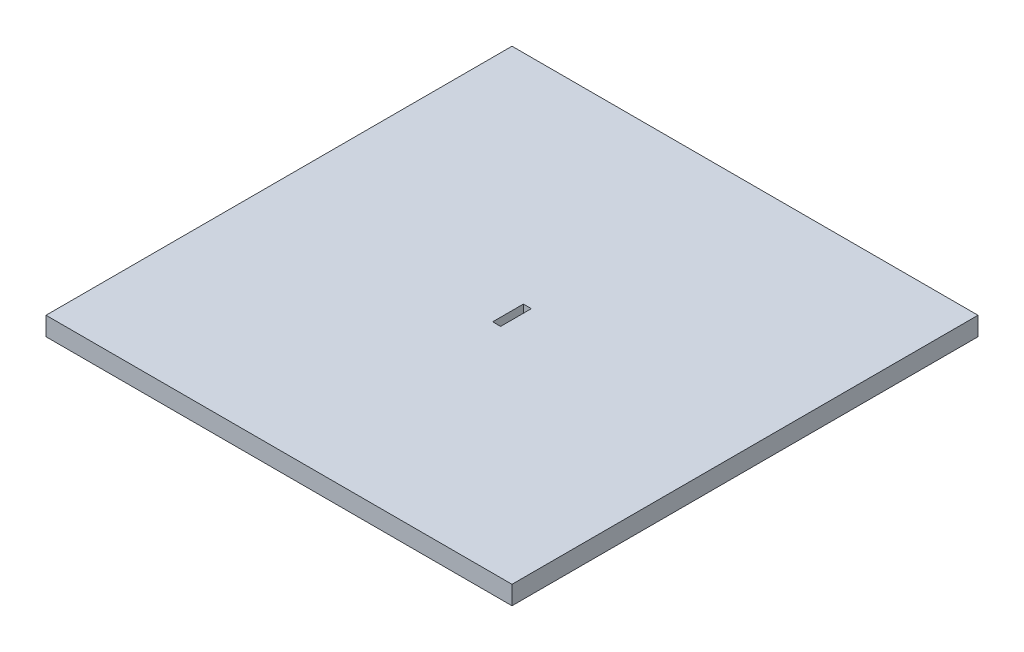
ISO-10303-21;
HEADER;
FILE_DESCRIPTION(('STEP AP214'),'2;1');
FILE_NAME('part.step','',(''),(''),'','','');
FILE_SCHEMA(('AUTOMOTIVE_DESIGN { 1 0 10303 214 1 1 1 1 }'));
ENDSEC;
DATA;
#1=APPLICATION_CONTEXT('core data for automotive mechanical design processes');
#2=APPLICATION_PROTOCOL_DEFINITION('international standard','automotive_design',2000,#1);
#3=PRODUCT_CONTEXT('',#1,'mechanical');
#4=PRODUCT('Part','Part','',(#3));
#5=PRODUCT_RELATED_PRODUCT_CATEGORY('part','',(#4));
#6=PRODUCT_DEFINITION_FORMATION('','',#4);
#7=PRODUCT_DEFINITION_CONTEXT('part definition',#1,'design');
#8=PRODUCT_DEFINITION('design','',#6,#7);
#9=PRODUCT_DEFINITION_SHAPE('','',#8);
#10=(LENGTH_UNIT() NAMED_UNIT(*) SI_UNIT(.MILLI.,.METRE.));
#11=(NAMED_UNIT(*) PLANE_ANGLE_UNIT() SI_UNIT($,.RADIAN.));
#12=(NAMED_UNIT(*) SI_UNIT($,.STERADIAN.) SOLID_ANGLE_UNIT());
#13=UNCERTAINTY_MEASURE_WITH_UNIT(LENGTH_MEASURE(1.E-05),#10,'distance_accuracy_value','');
#14=(GEOMETRIC_REPRESENTATION_CONTEXT(3) GLOBAL_UNCERTAINTY_ASSIGNED_CONTEXT((#13)) GLOBAL_UNIT_ASSIGNED_CONTEXT((#10,
#11,#12)) REPRESENTATION_CONTEXT('',''));
#15=CARTESIAN_POINT('',(0.,0.,0.));
#16=DIRECTION('',(0.,0.,1.));
#17=DIRECTION('',(1.,0.,0.));
#18=AXIS2_PLACEMENT_3D('',#15,#16,#17);
#19=CARTESIAN_POINT('',(50.,4.,50.));
#20=DIRECTION('',(-1.,0.,0.));
#21=DIRECTION('',(0.,0.,1.));
#22=AXIS2_PLACEMENT_3D('',#19,#20,#21);
#23=PLANE('',#22);
#24=DIRECTION('',(0.,0.,-1.));
#25=VECTOR('',#24,1.);
#26=CARTESIAN_POINT('',(50.,0.,50.));
#27=LINE('',#26,#25);
#28=CARTESIAN_POINT('',(50.,0.,50.));
#29=VERTEX_POINT('',#28);
#30=CARTESIAN_POINT('',(50.,0.,-50.));
#31=VERTEX_POINT('',#30);
#32=EDGE_CURVE('E132',#29,#31,#27,.T.);
#33=ORIENTED_EDGE('',*,*,#32,.T.);
#34=DIRECTION('',(0.,-1.,0.));
#35=VECTOR('',#34,1.);
#36=CARTESIAN_POINT('',(50.,4.,-50.));
#37=LINE('',#36,#35);
#38=CARTESIAN_POINT('',(50.,4.,-50.));
#39=VERTEX_POINT('',#38);
#40=EDGE_CURVE('E11',#39,#31,#37,.T.);
#41=ORIENTED_EDGE('',*,*,#40,.F.);
#42=DIRECTION('',(0.,0.,-1.));
#43=VECTOR('',#42,1.);
#44=CARTESIAN_POINT('',(50.,4.,50.));
#45=LINE('',#44,#43);
#46=CARTESIAN_POINT('',(50.,4.,50.));
#47=VERTEX_POINT('',#46);
#48=EDGE_CURVE('E136',#47,#39,#45,.T.);
#49=ORIENTED_EDGE('',*,*,#48,.F.);
#50=DIRECTION('',(0.,-1.,0.));
#51=VECTOR('',#50,1.);
#52=CARTESIAN_POINT('',(50.,4.,50.));
#53=LINE('',#52,#51);
#54=EDGE_CURVE('E146',#47,#29,#53,.T.);
#55=ORIENTED_EDGE('',*,*,#54,.T.);
#56=EDGE_LOOP('',(#33,#41,#49,#55));
#57=FACE_BOUND('',#56,.T.);
#58=ADVANCED_FACE('F35',(#57),#23,.F.);
#59=CARTESIAN_POINT('',(-50.,4.,-50.));
#60=DIRECTION('',(0.,0.,1.));
#61=DIRECTION('',(1.,0.,0.));
#62=AXIS2_PLACEMENT_3D('',#59,#60,#61);
#63=PLANE('',#62);
#64=DIRECTION('',(-1.,0.,0.));
#65=VECTOR('',#64,1.);
#66=CARTESIAN_POINT('',(-50.,0.,-50.));
#67=LINE('',#66,#65);
#68=CARTESIAN_POINT('',(-50.,0.,-50.));
#69=VERTEX_POINT('',#68);
#70=EDGE_CURVE('E149',#31,#69,#67,.T.);
#71=ORIENTED_EDGE('',*,*,#70,.T.);
#72=DIRECTION('',(0.,-1.,0.));
#73=VECTOR('',#72,1.);
#74=CARTESIAN_POINT('',(-50.,4.,-50.));
#75=LINE('',#74,#73);
#76=CARTESIAN_POINT('',(-50.,4.,-50.));
#77=VERTEX_POINT('',#76);
#78=EDGE_CURVE('E42',#77,#69,#75,.T.);
#79=ORIENTED_EDGE('',*,*,#78,.F.);
#80=DIRECTION('',(-1.,0.,0.));
#81=VECTOR('',#80,1.);
#82=CARTESIAN_POINT('',(-50.,4.,-50.));
#83=LINE('',#82,#81);
#84=EDGE_CURVE('E139',#39,#77,#83,.T.);
#85=ORIENTED_EDGE('',*,*,#84,.F.);
#86=ORIENTED_EDGE('',*,*,#40,.T.);
#87=EDGE_LOOP('',(#71,#79,#85,#86));
#88=FACE_BOUND('',#87,.T.);
#89=ADVANCED_FACE('F177',(#88),#63,.F.);
#90=CARTESIAN_POINT('',(-50.,4.,50.));
#91=DIRECTION('',(1.,0.,0.));
#92=DIRECTION('',(0.,0.,-1.));
#93=AXIS2_PLACEMENT_3D('',#90,#91,#92);
#94=PLANE('',#93);
#95=DIRECTION('',(0.,0.,1.));
#96=VECTOR('',#95,1.);
#97=CARTESIAN_POINT('',(-50.,0.,50.));
#98=LINE('',#97,#96);
#99=CARTESIAN_POINT('',(-50.,0.,50.));
#100=VERTEX_POINT('',#99);
#101=EDGE_CURVE('E151',#69,#100,#98,.T.);
#102=ORIENTED_EDGE('',*,*,#101,.T.);
#103=DIRECTION('',(0.,-1.,0.));
#104=VECTOR('',#103,1.);
#105=CARTESIAN_POINT('',(-50.,4.,50.));
#106=LINE('',#105,#104);
#107=CARTESIAN_POINT('',(-50.,4.,50.));
#108=VERTEX_POINT('',#107);
#109=EDGE_CURVE('E156',#108,#100,#106,.T.);
#110=ORIENTED_EDGE('',*,*,#109,.F.);
#111=DIRECTION('',(0.,0.,1.));
#112=VECTOR('',#111,1.);
#113=CARTESIAN_POINT('',(-50.,4.,50.));
#114=LINE('',#113,#112);
#115=EDGE_CURVE('E142',#77,#108,#114,.T.);
#116=ORIENTED_EDGE('',*,*,#115,.F.);
#117=ORIENTED_EDGE('',*,*,#78,.T.);
#118=EDGE_LOOP('',(#102,#110,#116,#117));
#119=FACE_BOUND('',#118,.T.);
#120=ADVANCED_FACE('F163',(#119),#94,.F.);
#121=CARTESIAN_POINT('',(-50.,4.,50.));
#122=DIRECTION('',(0.,0.,-1.));
#123=DIRECTION('',(-1.,0.,0.));
#124=AXIS2_PLACEMENT_3D('',#121,#122,#123);
#125=PLANE('',#124);
#126=DIRECTION('',(1.,0.,0.));
#127=VECTOR('',#126,1.);
#128=CARTESIAN_POINT('',(-50.,0.,50.));
#129=LINE('',#128,#127);
#130=EDGE_CURVE('E140',#100,#29,#129,.T.);
#131=ORIENTED_EDGE('',*,*,#130,.T.);
#132=ORIENTED_EDGE('',*,*,#54,.F.);
#133=DIRECTION('',(1.,0.,0.));
#134=VECTOR('',#133,1.);
#135=CARTESIAN_POINT('',(-50.,4.,50.));
#136=LINE('',#135,#134);
#137=EDGE_CURVE('E144',#108,#47,#136,.T.);
#138=ORIENTED_EDGE('',*,*,#137,.F.);
#139=ORIENTED_EDGE('',*,*,#109,.T.);
#140=EDGE_LOOP('',(#131,#132,#138,#139));
#141=FACE_BOUND('',#140,.T.);
#142=ADVANCED_FACE('F170',(#141),#125,.F.);
#143=CARTESIAN_POINT('',(0.,4.,0.));
#144=DIRECTION('',(0.,-1.,0.));
#145=DIRECTION('',(0.,0.,-1.));
#146=AXIS2_PLACEMENT_3D('',#143,#144,#145);
#147=PLANE('',#146);
#148=DIRECTION('',(1.,0.,0.));
#149=VECTOR('',#148,1.);
#150=CARTESIAN_POINT('',(0.855,4.,3.3));
#151=LINE('',#150,#149);
#152=CARTESIAN_POINT('',(-0.855,4.,3.3));
#153=VERTEX_POINT('',#152);
#154=CARTESIAN_POINT('',(0.855,4.,3.3));
#155=VERTEX_POINT('',#154);
#156=EDGE_CURVE('E126',#153,#155,#151,.T.);
#157=ORIENTED_EDGE('',*,*,#156,.F.);
#158=DIRECTION('',(0.,0.,1.));
#159=VECTOR('',#158,1.);
#160=CARTESIAN_POINT('',(-0.855,4.,3.3));
#161=LINE('',#160,#159);
#162=CARTESIAN_POINT('',(-0.855,4.,-3.3));
#163=VERTEX_POINT('',#162);
#164=EDGE_CURVE('E49',#163,#153,#161,.T.);
#165=ORIENTED_EDGE('',*,*,#164,.F.);
#166=DIRECTION('',(-1.,0.,0.));
#167=VECTOR('',#166,1.);
#168=CARTESIAN_POINT('',(0.855,4.,-3.3));
#169=LINE('',#168,#167);
#170=CARTESIAN_POINT('',(0.855,4.,-3.3));
#171=VERTEX_POINT('',#170);
#172=EDGE_CURVE('E117',#171,#163,#169,.T.);
#173=ORIENTED_EDGE('',*,*,#172,.F.);
#174=DIRECTION('',(0.,0.,-1.));
#175=VECTOR('',#174,1.);
#176=CARTESIAN_POINT('',(0.855,4.,3.3));
#177=LINE('',#176,#175);
#178=EDGE_CURVE('E120',#155,#171,#177,.T.);
#179=ORIENTED_EDGE('',*,*,#178,.F.);
#180=EDGE_LOOP('',(#157,#165,#173,#179));
#181=FACE_BOUND('',#180,.T.);
#182=ORIENTED_EDGE('',*,*,#48,.T.);
#183=ORIENTED_EDGE('',*,*,#84,.T.);
#184=ORIENTED_EDGE('',*,*,#115,.T.);
#185=ORIENTED_EDGE('',*,*,#137,.T.);
#186=EDGE_LOOP('',(#182,#183,#184,#185));
#187=FACE_BOUND('',#186,.T.);
#188=ADVANCED_FACE('F176',(#181,#187),#147,.F.);
#189=CARTESIAN_POINT('',(0.,0.,0.));
#190=DIRECTION('',(0.,-1.,0.));
#191=DIRECTION('',(0.,0.,-1.));
#192=AXIS2_PLACEMENT_3D('',#189,#190,#191);
#193=PLANE('',#192);
#194=DIRECTION('',(0.,0.,1.));
#195=VECTOR('',#194,1.);
#196=CARTESIAN_POINT('',(-0.855,0.,3.3));
#197=LINE('',#196,#195);
#198=CARTESIAN_POINT('',(-0.855,0.,-3.3));
#199=VERTEX_POINT('',#198);
#200=CARTESIAN_POINT('',(-0.855,0.,3.3));
#201=VERTEX_POINT('',#200);
#202=EDGE_CURVE('E101',#199,#201,#197,.T.);
#203=ORIENTED_EDGE('',*,*,#202,.T.);
#204=DIRECTION('',(1.,0.,0.));
#205=VECTOR('',#204,1.);
#206=CARTESIAN_POINT('',(0.855,0.,3.3));
#207=LINE('',#206,#205);
#208=CARTESIAN_POINT('',(0.855,0.,3.3));
#209=VERTEX_POINT('',#208);
#210=EDGE_CURVE('E110',#201,#209,#207,.T.);
#211=ORIENTED_EDGE('',*,*,#210,.T.);
#212=DIRECTION('',(0.,0.,-1.));
#213=VECTOR('',#212,1.);
#214=CARTESIAN_POINT('',(0.855,0.,3.3));
#215=LINE('',#214,#213);
#216=CARTESIAN_POINT('',(0.855,0.,-3.3));
#217=VERTEX_POINT('',#216);
#218=EDGE_CURVE('E57',#209,#217,#215,.T.);
#219=ORIENTED_EDGE('',*,*,#218,.T.);
#220=DIRECTION('',(-1.,0.,0.));
#221=VECTOR('',#220,1.);
#222=CARTESIAN_POINT('',(0.855,0.,-3.3));
#223=LINE('',#222,#221);
#224=EDGE_CURVE('E107',#217,#199,#223,.T.);
#225=ORIENTED_EDGE('',*,*,#224,.T.);
#226=EDGE_LOOP('',(#203,#211,#219,#225));
#227=FACE_BOUND('',#226,.T.);
#228=ORIENTED_EDGE('',*,*,#32,.F.);
#229=ORIENTED_EDGE('',*,*,#130,.F.);
#230=ORIENTED_EDGE('',*,*,#101,.F.);
#231=ORIENTED_EDGE('',*,*,#70,.F.);
#232=EDGE_LOOP('',(#228,#229,#230,#231));
#233=FACE_BOUND('',#232,.T.);
#234=ADVANCED_FACE('F114',(#227,#233),#193,.T.);
#235=CARTESIAN_POINT('',(-0.855,0.,3.3));
#236=DIRECTION('',(-1.,0.,0.));
#237=DIRECTION('',(0.,0.,1.));
#238=AXIS2_PLACEMENT_3D('',#235,#236,#237);
#239=PLANE('',#238);
#240=ORIENTED_EDGE('',*,*,#164,.T.);
#241=DIRECTION('',(0.,1.,0.));
#242=VECTOR('',#241,1.);
#243=CARTESIAN_POINT('',(-0.855,0.,3.3));
#244=LINE('',#243,#242);
#245=EDGE_CURVE('E97',#201,#153,#244,.T.);
#246=ORIENTED_EDGE('',*,*,#245,.F.);
#247=ORIENTED_EDGE('',*,*,#202,.F.);
#248=DIRECTION('',(0.,1.,0.));
#249=VECTOR('',#248,1.);
#250=CARTESIAN_POINT('',(-0.855,0.,-3.3));
#251=LINE('',#250,#249);
#252=EDGE_CURVE('E130',#199,#163,#251,.T.);
#253=ORIENTED_EDGE('',*,*,#252,.T.);
#254=EDGE_LOOP('',(#240,#246,#247,#253));
#255=FACE_BOUND('',#254,.T.);
#256=ADVANCED_FACE('F99',(#255),#239,.F.);
#257=CARTESIAN_POINT('',(0.855,0.,-3.3));
#258=DIRECTION('',(0.,0.,-1.));
#259=DIRECTION('',(-1.,0.,0.));
#260=AXIS2_PLACEMENT_3D('',#257,#258,#259);
#261=PLANE('',#260);
#262=ORIENTED_EDGE('',*,*,#172,.T.);
#263=ORIENTED_EDGE('',*,*,#252,.F.);
#264=ORIENTED_EDGE('',*,*,#224,.F.);
#265=DIRECTION('',(0.,1.,0.));
#266=VECTOR('',#265,1.);
#267=CARTESIAN_POINT('',(0.855,0.,-3.3));
#268=LINE('',#267,#266);
#269=EDGE_CURVE('E133',#217,#171,#268,.T.);
#270=ORIENTED_EDGE('',*,*,#269,.T.);
#271=EDGE_LOOP('',(#262,#263,#264,#270));
#272=FACE_BOUND('',#271,.T.);
#273=ADVANCED_FACE('F194',(#272),#261,.F.);
#274=CARTESIAN_POINT('',(0.855,0.,3.3));
#275=DIRECTION('',(1.,0.,0.));
#276=DIRECTION('',(0.,0.,-1.));
#277=AXIS2_PLACEMENT_3D('',#274,#275,#276);
#278=PLANE('',#277);
#279=ORIENTED_EDGE('',*,*,#178,.T.);
#280=ORIENTED_EDGE('',*,*,#269,.F.);
#281=ORIENTED_EDGE('',*,*,#218,.F.);
#282=DIRECTION('',(0.,1.,0.));
#283=VECTOR('',#282,1.);
#284=CARTESIAN_POINT('',(0.855,0.,3.3));
#285=LINE('',#284,#283);
#286=EDGE_CURVE('E106',#209,#155,#285,.T.);
#287=ORIENTED_EDGE('',*,*,#286,.T.);
#288=EDGE_LOOP('',(#279,#280,#281,#287));
#289=FACE_BOUND('',#288,.T.);
#290=ADVANCED_FACE('F197',(#289),#278,.F.);
#291=CARTESIAN_POINT('',(0.855,0.,3.3));
#292=DIRECTION('',(0.,0.,1.));
#293=DIRECTION('',(1.,0.,0.));
#294=AXIS2_PLACEMENT_3D('',#291,#292,#293);
#295=PLANE('',#294);
#296=ORIENTED_EDGE('',*,*,#156,.T.);
#297=ORIENTED_EDGE('',*,*,#286,.F.);
#298=ORIENTED_EDGE('',*,*,#210,.F.);
#299=ORIENTED_EDGE('',*,*,#245,.T.);
#300=EDGE_LOOP('',(#296,#297,#298,#299));
#301=FACE_BOUND('',#300,.T.);
#302=ADVANCED_FACE('F111',(#301),#295,.F.);
#303=CLOSED_SHELL('',(#58,#89,#120,#142,#188,#234,#256,#273,#290,#302));
#304=MANIFOLD_SOLID_BREP('B2',#303);
#305=ADVANCED_BREP_SHAPE_REPRESENTATION('',(#18,#304),#14);
#306=SHAPE_DEFINITION_REPRESENTATION(#9,#305);
ENDSEC;
END-ISO-10303-21;
